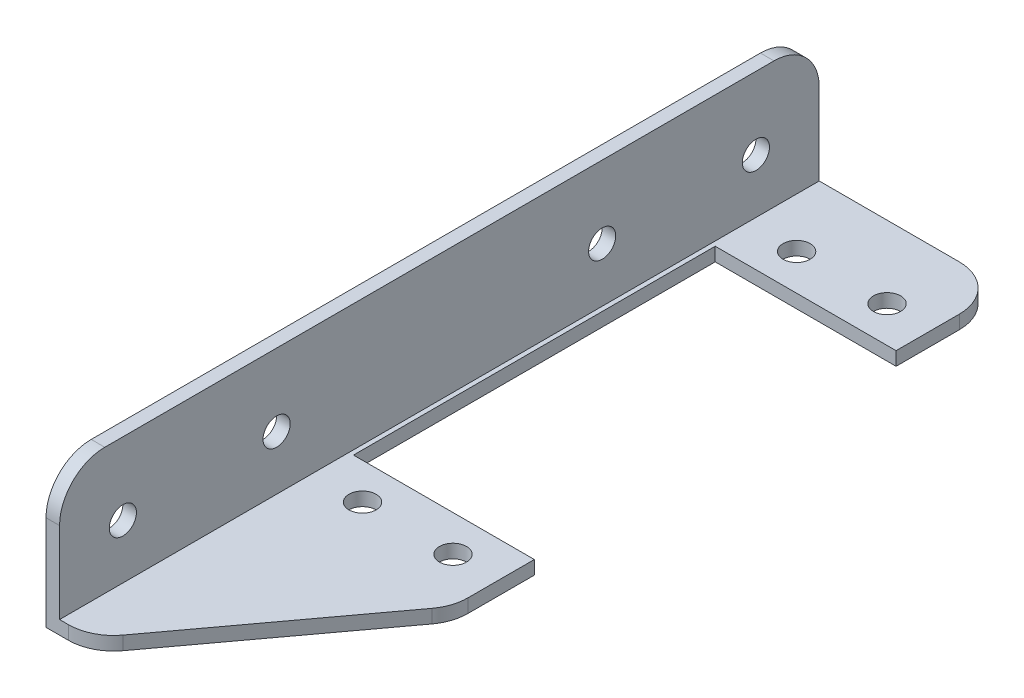
ISO-10303-21;
HEADER;
FILE_DESCRIPTION(('STEP AP214'),'2;1');
FILE_NAME('part.step','',(''),(''),'','','');
FILE_SCHEMA(('AUTOMOTIVE_DESIGN { 1 0 10303 214 1 1 1 1 }'));
ENDSEC;
DATA;
#1=APPLICATION_CONTEXT('core data for automotive mechanical design processes');
#2=APPLICATION_PROTOCOL_DEFINITION('international standard','automotive_design',2000,#1);
#3=PRODUCT_CONTEXT('',#1,'mechanical');
#4=PRODUCT('Part','Part','',(#3));
#5=PRODUCT_RELATED_PRODUCT_CATEGORY('part','',(#4));
#6=PRODUCT_DEFINITION_FORMATION('','',#4);
#7=PRODUCT_DEFINITION_CONTEXT('part definition',#1,'design');
#8=PRODUCT_DEFINITION('design','',#6,#7);
#9=PRODUCT_DEFINITION_SHAPE('','',#8);
#10=(LENGTH_UNIT() NAMED_UNIT(*) SI_UNIT(.MILLI.,.METRE.));
#11=(NAMED_UNIT(*) PLANE_ANGLE_UNIT() SI_UNIT($,.RADIAN.));
#12=(NAMED_UNIT(*) SI_UNIT($,.STERADIAN.) SOLID_ANGLE_UNIT());
#13=UNCERTAINTY_MEASURE_WITH_UNIT(LENGTH_MEASURE(1.E-05),#10,'distance_accuracy_value','');
#14=(GEOMETRIC_REPRESENTATION_CONTEXT(3) GLOBAL_UNCERTAINTY_ASSIGNED_CONTEXT((#13)) GLOBAL_UNIT_ASSIGNED_CONTEXT((#10,
#11,#12)) REPRESENTATION_CONTEXT('',''));
#15=CARTESIAN_POINT('',(0.,0.,0.));
#16=DIRECTION('',(0.,0.,1.));
#17=DIRECTION('',(1.,0.,0.));
#18=AXIS2_PLACEMENT_3D('',#15,#16,#17);
#19=CARTESIAN_POINT('',(0.,0.,84.));
#20=DIRECTION('',(0.,1.,0.));
#21=DIRECTION('',(0.,0.,1.));
#22=AXIS2_PLACEMENT_3D('',#19,#20,#21);
#23=PLANE('',#22);
#24=CARTESIAN_POINT('',(7.,0.,8.));
#25=DIRECTION('',(0.,-1.,0.));
#26=DIRECTION('',(0.,0.,1.));
#27=AXIS2_PLACEMENT_3D('',#24,#25,#26);
#28=CIRCLE('',#27,1.5);
#29=CARTESIAN_POINT('',(7.,0.,9.5));
#30=VERTEX_POINT('',#29);
#31=EDGE_CURVE('E318',#30,#30,#28,.T.);
#32=ORIENTED_EDGE('',*,*,#31,.F.);
#33=EDGE_LOOP('',(#32));
#34=FACE_BOUND('',#33,.T.);
#35=CARTESIAN_POINT('',(17.,0.,8.));
#36=DIRECTION('',(0.,-1.,0.));
#37=DIRECTION('',(0.,0.,1.));
#38=AXIS2_PLACEMENT_3D('',#35,#36,#37);
#39=CIRCLE('',#38,1.5);
#40=CARTESIAN_POINT('',(17.,0.,9.5));
#41=VERTEX_POINT('',#40);
#42=EDGE_CURVE('E321',#41,#41,#39,.T.);
#43=ORIENTED_EDGE('',*,*,#42,.F.);
#44=EDGE_LOOP('',(#43));
#45=FACE_BOUND('',#44,.T.);
#46=CARTESIAN_POINT('',(17.,0.,56.));
#47=DIRECTION('',(0.,-1.,0.));
#48=DIRECTION('',(0.,0.,-1.));
#49=AXIS2_PLACEMENT_3D('',#46,#47,#48);
#50=CIRCLE('',#49,1.5);
#51=CARTESIAN_POINT('',(17.,0.,54.5));
#52=VERTEX_POINT('',#51);
#53=EDGE_CURVE('E334',#52,#52,#50,.T.);
#54=ORIENTED_EDGE('',*,*,#53,.F.);
#55=EDGE_LOOP('',(#54));
#56=FACE_BOUND('',#55,.T.);
#57=CARTESIAN_POINT('',(7.,0.,56.));
#58=DIRECTION('',(0.,-1.,0.));
#59=DIRECTION('',(0.,0.,-1.));
#60=AXIS2_PLACEMENT_3D('',#57,#58,#59);
#61=CIRCLE('',#60,1.5);
#62=CARTESIAN_POINT('',(7.,0.,54.5));
#63=VERTEX_POINT('',#62);
#64=EDGE_CURVE('E332',#63,#63,#61,.T.);
#65=ORIENTED_EDGE('',*,*,#64,.F.);
#66=EDGE_LOOP('',(#65));
#67=FACE_BOUND('',#66,.T.);
#68=DIRECTION('',(0.,0.,-1.));
#69=VECTOR('',#68,1.);
#70=CARTESIAN_POINT('',(22.,0.,84.));
#71=LINE('',#70,#69);
#72=CARTESIAN_POINT('',(22.,0.,59.3527355023087));
#73=VERTEX_POINT('',#72);
#74=CARTESIAN_POINT('',(22.,0.,52.));
#75=VERTEX_POINT('',#74);
#76=EDGE_CURVE('E165',#73,#75,#71,.T.);
#77=ORIENTED_EDGE('',*,*,#76,.F.);
#78=CARTESIAN_POINT('',(17.,0.,59.3527355023087));
#79=DIRECTION('',(0.,1.,0.));
#80=DIRECTION('',(0.,0.,1.));
#81=AXIS2_PLACEMENT_3D('',#78,#79,#80);
#82=CIRCLE('',#81,5.);
#83=CARTESIAN_POINT('',(21.0208807073316,0.,62.3246908077277));
#84=VERTEX_POINT('',#83);
#85=EDGE_CURVE('E270',#73,#84,#82,.F.);
#86=ORIENTED_EDGE('',*,*,#85,.T.);
#87=DIRECTION('',(0.594391061083805,0.,-0.804176141466326));
#88=VECTOR('',#87,1.);
#89=CARTESIAN_POINT('',(22.,0.,60.9999999999999));
#90=LINE('',#89,#88);
#91=CARTESIAN_POINT('',(6.49898955686415,0.,81.971955305419));
#92=VERTEX_POINT('',#91);
#93=EDGE_CURVE('E258',#84,#92,#90,.F.);
#94=ORIENTED_EDGE('',*,*,#93,.T.);
#95=CARTESIAN_POINT('',(2.47810884953252,0.,79.));
#96=DIRECTION('',(0.,1.,0.));
#97=DIRECTION('',(0.,0.,1.));
#98=AXIS2_PLACEMENT_3D('',#95,#96,#97);
#99=CIRCLE('',#98,5.);
#100=CARTESIAN_POINT('',(2.47810884953252,0.,84.));
#101=VERTEX_POINT('',#100);
#102=EDGE_CURVE('E268',#92,#101,#99,.F.);
#103=ORIENTED_EDGE('',*,*,#102,.T.);
#104=DIRECTION('',(1.,0.,0.));
#105=VECTOR('',#104,1.);
#106=CARTESIAN_POINT('',(0.,0.,84.));
#107=LINE('',#106,#105);
#108=CARTESIAN_POINT('',(0.,0.,84.));
#109=VERTEX_POINT('',#108);
#110=EDGE_CURVE('E208',#109,#101,#107,.T.);
#111=ORIENTED_EDGE('',*,*,#110,.F.);
#112=DIRECTION('',(0.,0.,-1.));
#113=VECTOR('',#112,1.);
#114=CARTESIAN_POINT('',(0.,0.,84.));
#115=LINE('',#114,#113);
#116=CARTESIAN_POINT('',(0.,0.,0.));
#117=VERTEX_POINT('',#116);
#118=EDGE_CURVE('E219',#109,#117,#115,.T.);
#119=ORIENTED_EDGE('',*,*,#118,.T.);
#120=DIRECTION('',(1.,0.,0.));
#121=VECTOR('',#120,1.);
#122=CARTESIAN_POINT('',(0.,0.,0.));
#123=LINE('',#122,#121);
#124=CARTESIAN_POINT('',(17.,0.,0.));
#125=VERTEX_POINT('',#124);
#126=EDGE_CURVE('E207',#117,#125,#123,.T.);
#127=ORIENTED_EDGE('',*,*,#126,.T.);
#128=CARTESIAN_POINT('',(17.,0.,5.));
#129=DIRECTION('',(0.,1.,0.));
#130=DIRECTION('',(0.,0.,1.));
#131=AXIS2_PLACEMENT_3D('',#128,#129,#130);
#132=CIRCLE('',#131,5.);
#133=CARTESIAN_POINT('',(22.,0.,5.00000000000003));
#134=VERTEX_POINT('',#133);
#135=EDGE_CURVE('E164',#125,#134,#132,.F.);
#136=ORIENTED_EDGE('',*,*,#135,.T.);
#137=CARTESIAN_POINT('',(22.,0.,12.));
#138=VERTEX_POINT('',#137);
#139=EDGE_CURVE('E149',#138,#134,#71,.T.);
#140=ORIENTED_EDGE('',*,*,#139,.F.);
#141=DIRECTION('',(1.,0.,0.));
#142=VECTOR('',#141,1.);
#143=CARTESIAN_POINT('',(27.5,0.,12.));
#144=LINE('',#143,#142);
#145=CARTESIAN_POINT('',(2.,0.,12.));
#146=VERTEX_POINT('',#145);
#147=EDGE_CURVE('E162',#146,#138,#144,.T.);
#148=ORIENTED_EDGE('',*,*,#147,.F.);
#149=DIRECTION('',(0.,0.,-1.));
#150=VECTOR('',#149,1.);
#151=CARTESIAN_POINT('',(2.,0.,52.));
#152=LINE('',#151,#150);
#153=CARTESIAN_POINT('',(2.,0.,52.));
#154=VERTEX_POINT('',#153);
#155=EDGE_CURVE('E172',#154,#146,#152,.T.);
#156=ORIENTED_EDGE('',*,*,#155,.F.);
#157=DIRECTION('',(-1.,0.,0.));
#158=VECTOR('',#157,1.);
#159=CARTESIAN_POINT('',(27.5,0.,52.));
#160=LINE('',#159,#158);
#161=EDGE_CURVE('E176',#75,#154,#160,.T.);
#162=ORIENTED_EDGE('',*,*,#161,.F.);
#163=EDGE_LOOP('',(#77,#86,#94,#103,#111,#119,#127,#136,#140,#148,#156,#162));
#164=FACE_BOUND('',#163,.T.);
#165=ADVANCED_FACE('F32',(#34,#45,#56,#67,#164),#23,.F.);
#166=CARTESIAN_POINT('',(0.,1.5,84.));
#167=DIRECTION('',(0.,1.,0.));
#168=DIRECTION('',(0.,0.,1.));
#169=AXIS2_PLACEMENT_3D('',#166,#167,#168);
#170=PLANE('',#169);
#171=DIRECTION('',(-0.594391061083805,0.,0.804176141466326));
#172=VECTOR('',#171,1.);
#173=CARTESIAN_POINT('',(3.23349633251831,1.5,86.3899755501222));
#174=LINE('',#173,#172);
#175=CARTESIAN_POINT('',(6.49898955686415,1.5,81.971955305419));
#176=VERTEX_POINT('',#175);
#177=CARTESIAN_POINT('',(21.0208807073316,1.5,62.3246908077277));
#178=VERTEX_POINT('',#177);
#179=EDGE_CURVE('E261',#176,#178,#174,.F.);
#180=ORIENTED_EDGE('',*,*,#179,.T.);
#181=CARTESIAN_POINT('',(17.,1.5,59.3527355023087));
#182=DIRECTION('',(0.,1.,0.));
#183=DIRECTION('',(0.,0.,1.));
#184=AXIS2_PLACEMENT_3D('',#181,#182,#183);
#185=CIRCLE('',#184,5.);
#186=CARTESIAN_POINT('',(22.,1.5,59.3527355023087));
#187=VERTEX_POINT('',#186);
#188=EDGE_CURVE('E280',#178,#187,#185,.T.);
#189=ORIENTED_EDGE('',*,*,#188,.T.);
#190=DIRECTION('',(0.,0.,1.));
#191=VECTOR('',#190,1.);
#192=CARTESIAN_POINT('',(22.,1.5,84.));
#193=LINE('',#192,#191);
#194=CARTESIAN_POINT('',(22.,1.5,52.));
#195=VERTEX_POINT('',#194);
#196=EDGE_CURVE('E156',#195,#187,#193,.T.);
#197=ORIENTED_EDGE('',*,*,#196,.F.);
#198=DIRECTION('',(1.,0.,0.));
#199=VECTOR('',#198,1.);
#200=CARTESIAN_POINT('',(0.,1.5,52.));
#201=LINE('',#200,#199);
#202=CARTESIAN_POINT('',(2.,1.5,52.));
#203=VERTEX_POINT('',#202);
#204=EDGE_CURVE('E237',#203,#195,#201,.T.);
#205=ORIENTED_EDGE('',*,*,#204,.F.);
#206=DIRECTION('',(0.,0.,1.));
#207=VECTOR('',#206,1.);
#208=CARTESIAN_POINT('',(2.,1.5,84.));
#209=LINE('',#208,#207);
#210=CARTESIAN_POINT('',(2.,1.5,12.));
#211=VERTEX_POINT('',#210);
#212=EDGE_CURVE('E240',#211,#203,#209,.T.);
#213=ORIENTED_EDGE('',*,*,#212,.F.);
#214=DIRECTION('',(-1.,0.,0.));
#215=VECTOR('',#214,1.);
#216=CARTESIAN_POINT('',(0.,1.5,12.));
#217=LINE('',#216,#215);
#218=CARTESIAN_POINT('',(22.,1.5,12.));
#219=VERTEX_POINT('',#218);
#220=EDGE_CURVE('E243',#219,#211,#217,.T.);
#221=ORIENTED_EDGE('',*,*,#220,.F.);
#222=CARTESIAN_POINT('',(22.,1.5,5.));
#223=VERTEX_POINT('',#222);
#224=EDGE_CURVE('E152',#223,#219,#193,.T.);
#225=ORIENTED_EDGE('',*,*,#224,.F.);
#226=CARTESIAN_POINT('',(17.,1.5,5.));
#227=DIRECTION('',(0.,1.,0.));
#228=DIRECTION('',(0.,0.,1.));
#229=AXIS2_PLACEMENT_3D('',#226,#227,#228);
#230=CIRCLE('',#229,5.);
#231=CARTESIAN_POINT('',(17.,1.5,0.));
#232=VERTEX_POINT('',#231);
#233=EDGE_CURVE('E276',#223,#232,#230,.T.);
#234=ORIENTED_EDGE('',*,*,#233,.T.);
#235=DIRECTION('',(1.,0.,0.));
#236=VECTOR('',#235,1.);
#237=CARTESIAN_POINT('',(0.,1.5,0.));
#238=LINE('',#237,#236);
#239=CARTESIAN_POINT('',(1.5,1.5,0.));
#240=VERTEX_POINT('',#239);
#241=EDGE_CURVE('E221',#240,#232,#238,.T.);
#242=ORIENTED_EDGE('',*,*,#241,.F.);
#243=DIRECTION('',(0.,0.,-1.));
#244=VECTOR('',#243,1.);
#245=CARTESIAN_POINT('',(1.5,1.5,84.));
#246=LINE('',#245,#244);
#247=CARTESIAN_POINT('',(1.5,1.5,84.));
#248=VERTEX_POINT('',#247);
#249=EDGE_CURVE('E234',#248,#240,#246,.T.);
#250=ORIENTED_EDGE('',*,*,#249,.F.);
#251=DIRECTION('',(1.,0.,0.));
#252=VECTOR('',#251,1.);
#253=CARTESIAN_POINT('',(0.,1.5,84.));
#254=LINE('',#253,#252);
#255=CARTESIAN_POINT('',(2.47810884953252,1.5,84.));
#256=VERTEX_POINT('',#255);
#257=EDGE_CURVE('E211',#248,#256,#254,.T.);
#258=ORIENTED_EDGE('',*,*,#257,.T.);
#259=CARTESIAN_POINT('',(2.47810884953252,1.5,79.));
#260=DIRECTION('',(0.,1.,0.));
#261=DIRECTION('',(0.,0.,1.));
#262=AXIS2_PLACEMENT_3D('',#259,#260,#261);
#263=CIRCLE('',#262,5.);
#264=EDGE_CURVE('E278',#256,#176,#263,.T.);
#265=ORIENTED_EDGE('',*,*,#264,.T.);
#266=EDGE_LOOP('',(#180,#189,#197,#205,#213,#221,#225,#234,#242,#250,#258,#265));
#267=FACE_BOUND('',#266,.T.);
#268=CARTESIAN_POINT('',(7.,1.5,8.));
#269=DIRECTION('',(0.,1.,0.));
#270=DIRECTION('',(0.,0.,1.));
#271=AXIS2_PLACEMENT_3D('',#268,#269,#270);
#272=CIRCLE('',#271,1.5);
#273=CARTESIAN_POINT('',(7.,1.5,9.5));
#274=VERTEX_POINT('',#273);
#275=EDGE_CURVE('E195',#274,#274,#272,.T.);
#276=ORIENTED_EDGE('',*,*,#275,.F.);
#277=EDGE_LOOP('',(#276));
#278=FACE_BOUND('',#277,.T.);
#279=CARTESIAN_POINT('',(17.,1.5,8.));
#280=DIRECTION('',(0.,1.,0.));
#281=DIRECTION('',(0.,0.,1.));
#282=AXIS2_PLACEMENT_3D('',#279,#280,#281);
#283=CIRCLE('',#282,1.5);
#284=CARTESIAN_POINT('',(17.,1.5,9.5));
#285=VERTEX_POINT('',#284);
#286=EDGE_CURVE('E251',#285,#285,#283,.T.);
#287=ORIENTED_EDGE('',*,*,#286,.F.);
#288=EDGE_LOOP('',(#287));
#289=FACE_BOUND('',#288,.T.);
#290=CARTESIAN_POINT('',(17.,1.5,56.));
#291=DIRECTION('',(0.,1.,0.));
#292=DIRECTION('',(0.,0.,1.));
#293=AXIS2_PLACEMENT_3D('',#290,#291,#292);
#294=CIRCLE('',#293,1.5);
#295=CARTESIAN_POINT('',(17.,1.5,57.5));
#296=VERTEX_POINT('',#295);
#297=EDGE_CURVE('E248',#296,#296,#294,.T.);
#298=ORIENTED_EDGE('',*,*,#297,.F.);
#299=EDGE_LOOP('',(#298));
#300=FACE_BOUND('',#299,.T.);
#301=CARTESIAN_POINT('',(7.,1.5,56.));
#302=DIRECTION('',(0.,1.,0.));
#303=DIRECTION('',(0.,0.,1.));
#304=AXIS2_PLACEMENT_3D('',#301,#302,#303);
#305=CIRCLE('',#304,1.5);
#306=CARTESIAN_POINT('',(7.,1.5,57.5));
#307=VERTEX_POINT('',#306);
#308=EDGE_CURVE('E180',#307,#307,#305,.T.);
#309=ORIENTED_EDGE('',*,*,#308,.F.);
#310=EDGE_LOOP('',(#309));
#311=FACE_BOUND('',#310,.T.);
#312=ADVANCED_FACE('F312',(#267,#278,#289,#300,#311),#170,.T.);
#313=CARTESIAN_POINT('',(1.5,15.5,84.));
#314=DIRECTION('',(1.,0.,0.));
#315=DIRECTION('',(0.,1.,0.));
#316=AXIS2_PLACEMENT_3D('',#313,#314,#315);
#317=PLANE('',#316);
#318=CARTESIAN_POINT('',(1.5,7.5,7.));
#319=DIRECTION('',(1.,0.,0.));
#320=DIRECTION('',(0.,1.,0.));
#321=AXIS2_PLACEMENT_3D('',#318,#319,#320);
#322=CIRCLE('',#321,1.5);
#323=CARTESIAN_POINT('',(1.5,9.00000000000001,7.));
#324=VERTEX_POINT('',#323);
#325=EDGE_CURVE('E204',#324,#324,#322,.T.);
#326=ORIENTED_EDGE('',*,*,#325,.F.);
#327=EDGE_LOOP('',(#326));
#328=FACE_BOUND('',#327,.T.);
#329=CARTESIAN_POINT('',(1.5,7.5,24.));
#330=DIRECTION('',(1.,0.,0.));
#331=DIRECTION('',(0.,1.,0.));
#332=AXIS2_PLACEMENT_3D('',#329,#330,#331);
#333=CIRCLE('',#332,1.5);
#334=CARTESIAN_POINT('',(1.5,9.00000000000001,24.));
#335=VERTEX_POINT('',#334);
#336=EDGE_CURVE('E201',#335,#335,#333,.T.);
#337=ORIENTED_EDGE('',*,*,#336,.F.);
#338=EDGE_LOOP('',(#337));
#339=FACE_BOUND('',#338,.T.);
#340=CARTESIAN_POINT('',(1.5,7.50000000000001,60.));
#341=DIRECTION('',(1.,0.,0.));
#342=DIRECTION('',(0.,1.,0.));
#343=AXIS2_PLACEMENT_3D('',#340,#341,#342);
#344=CIRCLE('',#343,1.5);
#345=CARTESIAN_POINT('',(1.5,9.00000000000001,60.));
#346=VERTEX_POINT('',#345);
#347=EDGE_CURVE('E198',#346,#346,#344,.T.);
#348=ORIENTED_EDGE('',*,*,#347,.F.);
#349=EDGE_LOOP('',(#348));
#350=FACE_BOUND('',#349,.T.);
#351=CARTESIAN_POINT('',(1.5,7.50000000000001,77.));
#352=DIRECTION('',(1.,0.,0.));
#353=DIRECTION('',(0.,1.,0.));
#354=AXIS2_PLACEMENT_3D('',#351,#352,#353);
#355=CIRCLE('',#354,1.5);
#356=CARTESIAN_POINT('',(1.5,9.00000000000001,77.));
#357=VERTEX_POINT('',#356);
#358=EDGE_CURVE('E185',#357,#357,#355,.T.);
#359=ORIENTED_EDGE('',*,*,#358,.F.);
#360=EDGE_LOOP('',(#359));
#361=FACE_BOUND('',#360,.T.);
#362=DIRECTION('',(0.,0.,-1.));
#363=VECTOR('',#362,1.);
#364=CARTESIAN_POINT('',(1.5,15.5,84.));
#365=LINE('',#364,#363);
#366=CARTESIAN_POINT('',(1.5,15.5,79.));
#367=VERTEX_POINT('',#366);
#368=CARTESIAN_POINT('',(1.5,15.5,5.00000000000003));
#369=VERTEX_POINT('',#368);
#370=EDGE_CURVE('E231',#367,#369,#365,.T.);
#371=ORIENTED_EDGE('',*,*,#370,.F.);
#372=CARTESIAN_POINT('',(1.5,10.5,79.));
#373=DIRECTION('',(1.,0.,0.));
#374=DIRECTION('',(0.,1.,0.));
#375=AXIS2_PLACEMENT_3D('',#372,#373,#374);
#376=CIRCLE('',#375,5.);
#377=CARTESIAN_POINT('',(1.5,10.5,84.));
#378=VERTEX_POINT('',#377);
#379=EDGE_CURVE('E293',#367,#378,#376,.T.);
#380=ORIENTED_EDGE('',*,*,#379,.T.);
#381=DIRECTION('',(0.,-1.,0.));
#382=VECTOR('',#381,1.);
#383=CARTESIAN_POINT('',(1.5,15.5,84.));
#384=LINE('',#383,#382);
#385=EDGE_CURVE('E215',#378,#248,#384,.T.);
#386=ORIENTED_EDGE('',*,*,#385,.T.);
#387=ORIENTED_EDGE('',*,*,#249,.T.);
#388=DIRECTION('',(0.,-1.,0.));
#389=VECTOR('',#388,1.);
#390=CARTESIAN_POINT('',(1.5,15.5,0.));
#391=LINE('',#390,#389);
#392=CARTESIAN_POINT('',(1.5,10.5,0.));
#393=VERTEX_POINT('',#392);
#394=EDGE_CURVE('E224',#393,#240,#391,.T.);
#395=ORIENTED_EDGE('',*,*,#394,.F.);
#396=CARTESIAN_POINT('',(1.5,10.5,5.));
#397=DIRECTION('',(1.,0.,0.));
#398=DIRECTION('',(0.,1.,0.));
#399=AXIS2_PLACEMENT_3D('',#396,#397,#398);
#400=CIRCLE('',#399,5.);
#401=EDGE_CURVE('E55',#393,#369,#400,.T.);
#402=ORIENTED_EDGE('',*,*,#401,.T.);
#403=EDGE_LOOP('',(#371,#380,#386,#387,#395,#402));
#404=FACE_BOUND('',#403,.T.);
#405=ADVANCED_FACE('F306',(#328,#339,#350,#361,#404),#317,.T.);
#406=CARTESIAN_POINT('',(0.,15.5,84.));
#407=DIRECTION('',(0.,1.,0.));
#408=DIRECTION('',(0.,0.,1.));
#409=AXIS2_PLACEMENT_3D('',#406,#407,#408);
#410=PLANE('',#409);
#411=DIRECTION('',(0.,0.,-1.));
#412=VECTOR('',#411,1.);
#413=CARTESIAN_POINT('',(0.,15.5,84.));
#414=LINE('',#413,#412);
#415=CARTESIAN_POINT('',(0.,15.5,79.));
#416=VERTEX_POINT('',#415);
#417=CARTESIAN_POINT('',(0.,15.5,5.00000000000003));
#418=VERTEX_POINT('',#417);
#419=EDGE_CURVE('E229',#416,#418,#414,.T.);
#420=ORIENTED_EDGE('',*,*,#419,.F.);
#421=DIRECTION('',(1.,0.,0.));
#422=VECTOR('',#421,1.);
#423=CARTESIAN_POINT('',(1.5,15.5,79.));
#424=LINE('',#423,#422);
#425=EDGE_CURVE('E289',#416,#367,#424,.T.);
#426=ORIENTED_EDGE('',*,*,#425,.T.);
#427=ORIENTED_EDGE('',*,*,#370,.T.);
#428=DIRECTION('',(1.,0.,0.));
#429=VECTOR('',#428,1.);
#430=CARTESIAN_POINT('',(0.,15.5,5.));
#431=LINE('',#430,#429);
#432=EDGE_CURVE('E287',#369,#418,#431,.F.);
#433=ORIENTED_EDGE('',*,*,#432,.T.);
#434=EDGE_LOOP('',(#420,#426,#427,#433));
#435=FACE_BOUND('',#434,.T.);
#436=ADVANCED_FACE('F402',(#435),#410,.T.);
#437=CARTESIAN_POINT('',(0.,15.5,84.));
#438=DIRECTION('',(1.,0.,0.));
#439=DIRECTION('',(0.,1.,0.));
#440=AXIS2_PLACEMENT_3D('',#437,#438,#439);
#441=PLANE('',#440);
#442=CARTESIAN_POINT('',(0.,7.5,7.));
#443=DIRECTION('',(-1.,0.,0.));
#444=DIRECTION('',(0.,-1.,0.));
#445=AXIS2_PLACEMENT_3D('',#442,#443,#444);
#446=CIRCLE('',#445,1.5);
#447=CARTESIAN_POINT('',(0.,6.,7.));
#448=VERTEX_POINT('',#447);
#449=EDGE_CURVE('E182',#448,#448,#446,.T.);
#450=ORIENTED_EDGE('',*,*,#449,.F.);
#451=EDGE_LOOP('',(#450));
#452=FACE_BOUND('',#451,.T.);
#453=CARTESIAN_POINT('',(0.,7.5,24.));
#454=DIRECTION('',(-1.,0.,0.));
#455=DIRECTION('',(0.,-1.,0.));
#456=AXIS2_PLACEMENT_3D('',#453,#454,#455);
#457=CIRCLE('',#456,1.5);
#458=CARTESIAN_POINT('',(0.,6.,24.));
#459=VERTEX_POINT('',#458);
#460=EDGE_CURVE('E186',#459,#459,#457,.T.);
#461=ORIENTED_EDGE('',*,*,#460,.F.);
#462=EDGE_LOOP('',(#461));
#463=FACE_BOUND('',#462,.T.);
#464=CARTESIAN_POINT('',(0.,7.5,60.));
#465=DIRECTION('',(-1.,0.,0.));
#466=DIRECTION('',(0.,-1.,0.));
#467=AXIS2_PLACEMENT_3D('',#464,#465,#466);
#468=CIRCLE('',#467,1.5);
#469=CARTESIAN_POINT('',(0.,6.,60.));
#470=VERTEX_POINT('',#469);
#471=EDGE_CURVE('E189',#470,#470,#468,.T.);
#472=ORIENTED_EDGE('',*,*,#471,.F.);
#473=EDGE_LOOP('',(#472));
#474=FACE_BOUND('',#473,.T.);
#475=CARTESIAN_POINT('',(0.,7.50000000000001,77.));
#476=DIRECTION('',(-1.,0.,0.));
#477=DIRECTION('',(0.,1.,0.));
#478=AXIS2_PLACEMENT_3D('',#475,#476,#477);
#479=CIRCLE('',#478,1.5);
#480=CARTESIAN_POINT('',(0.,9.00000000000001,77.));
#481=VERTEX_POINT('',#480);
#482=EDGE_CURVE('E192',#481,#481,#479,.T.);
#483=ORIENTED_EDGE('',*,*,#482,.F.);
#484=EDGE_LOOP('',(#483));
#485=FACE_BOUND('',#484,.T.);
#486=DIRECTION('',(0.,-1.,0.));
#487=VECTOR('',#486,1.);
#488=CARTESIAN_POINT('',(0.,15.5,84.));
#489=LINE('',#488,#487);
#490=CARTESIAN_POINT('',(0.,10.5,84.));
#491=VERTEX_POINT('',#490);
#492=EDGE_CURVE('E217',#491,#109,#489,.T.);
#493=ORIENTED_EDGE('',*,*,#492,.F.);
#494=CARTESIAN_POINT('',(0.,10.5,79.));
#495=DIRECTION('',(1.,0.,0.));
#496=DIRECTION('',(0.,1.,0.));
#497=AXIS2_PLACEMENT_3D('',#494,#495,#496);
#498=CIRCLE('',#497,5.);
#499=EDGE_CURVE('E296',#491,#416,#498,.F.);
#500=ORIENTED_EDGE('',*,*,#499,.T.);
#501=ORIENTED_EDGE('',*,*,#419,.T.);
#502=CARTESIAN_POINT('',(0.,10.5,5.));
#503=DIRECTION('',(1.,0.,0.));
#504=DIRECTION('',(0.,1.,0.));
#505=AXIS2_PLACEMENT_3D('',#502,#503,#504);
#506=CIRCLE('',#505,5.);
#507=CARTESIAN_POINT('',(0.,10.5,0.));
#508=VERTEX_POINT('',#507);
#509=EDGE_CURVE('E47',#418,#508,#506,.F.);
#510=ORIENTED_EDGE('',*,*,#509,.T.);
#511=DIRECTION('',(0.,-1.,0.));
#512=VECTOR('',#511,1.);
#513=CARTESIAN_POINT('',(0.,15.5,0.));
#514=LINE('',#513,#512);
#515=EDGE_CURVE('E212',#508,#117,#514,.T.);
#516=ORIENTED_EDGE('',*,*,#515,.T.);
#517=ORIENTED_EDGE('',*,*,#118,.F.);
#518=EDGE_LOOP('',(#493,#500,#501,#510,#516,#517));
#519=FACE_BOUND('',#518,.T.);
#520=ADVANCED_FACE('F396',(#452,#463,#474,#485,#519),#441,.F.);
#521=CARTESIAN_POINT('',(0.,0.,84.));
#522=DIRECTION('',(0.,0.,-1.));
#523=DIRECTION('',(-1.,0.,0.));
#524=AXIS2_PLACEMENT_3D('',#521,#522,#523);
#525=PLANE('',#524);
#526=ORIENTED_EDGE('',*,*,#110,.T.);
#527=DIRECTION('',(0.,-1.,0.));
#528=VECTOR('',#527,1.);
#529=CARTESIAN_POINT('',(2.47810884953252,1.5,84.));
#530=LINE('',#529,#528);
#531=EDGE_CURVE('E284',#101,#256,#530,.F.);
#532=ORIENTED_EDGE('',*,*,#531,.T.);
#533=ORIENTED_EDGE('',*,*,#257,.F.);
#534=ORIENTED_EDGE('',*,*,#385,.F.);
#535=DIRECTION('',(1.,0.,0.));
#536=VECTOR('',#535,1.);
#537=CARTESIAN_POINT('',(0.,10.5,84.));
#538=LINE('',#537,#536);
#539=EDGE_CURVE('E282',#378,#491,#538,.F.);
#540=ORIENTED_EDGE('',*,*,#539,.T.);
#541=ORIENTED_EDGE('',*,*,#492,.T.);
#542=EDGE_LOOP('',(#526,#532,#533,#534,#540,#541));
#543=FACE_BOUND('',#542,.T.);
#544=ADVANCED_FACE('F393',(#543),#525,.F.);
#545=CARTESIAN_POINT('',(0.,0.,0.));
#546=DIRECTION('',(0.,0.,-1.));
#547=DIRECTION('',(-1.,0.,0.));
#548=AXIS2_PLACEMENT_3D('',#545,#546,#547);
#549=PLANE('',#548);
#550=ORIENTED_EDGE('',*,*,#515,.F.);
#551=DIRECTION('',(1.,0.,0.));
#552=VECTOR('',#551,1.);
#553=CARTESIAN_POINT('',(0.,10.5,0.));
#554=LINE('',#553,#552);
#555=EDGE_CURVE('E40',#508,#393,#554,.T.);
#556=ORIENTED_EDGE('',*,*,#555,.T.);
#557=ORIENTED_EDGE('',*,*,#394,.T.);
#558=ORIENTED_EDGE('',*,*,#241,.T.);
#559=DIRECTION('',(0.,-1.,0.));
#560=VECTOR('',#559,1.);
#561=CARTESIAN_POINT('',(17.,0.,0.));
#562=LINE('',#561,#560);
#563=EDGE_CURVE('E298',#232,#125,#562,.T.);
#564=ORIENTED_EDGE('',*,*,#563,.T.);
#565=ORIENTED_EDGE('',*,*,#126,.F.);
#566=EDGE_LOOP('',(#550,#556,#557,#558,#564,#565));
#567=FACE_BOUND('',#566,.T.);
#568=ADVANCED_FACE('F302',(#567),#549,.T.);
#569=CARTESIAN_POINT('',(8.,7.50000000000001,77.));
#570=DIRECTION('',(-1.,0.,0.));
#571=DIRECTION('',(0.,-1.,0.));
#572=AXIS2_PLACEMENT_3D('',#569,#570,#571);
#573=CYLINDRICAL_SURFACE('',#572,1.5);
#574=ORIENTED_EDGE('',*,*,#358,.T.);
#575=EDGE_LOOP('',(#574));
#576=FACE_BOUND('',#575,.T.);
#577=ORIENTED_EDGE('',*,*,#482,.T.);
#578=EDGE_LOOP('',(#577));
#579=FACE_BOUND('',#578,.T.);
#580=ADVANCED_FACE('F388',(#576,#579),#573,.F.);
#581=CARTESIAN_POINT('',(8.,7.50000000000001,60.));
#582=DIRECTION('',(-1.,0.,0.));
#583=DIRECTION('',(0.,-1.,0.));
#584=AXIS2_PLACEMENT_3D('',#581,#582,#583);
#585=CYLINDRICAL_SURFACE('',#584,1.5);
#586=ORIENTED_EDGE('',*,*,#347,.T.);
#587=EDGE_LOOP('',(#586));
#588=FACE_BOUND('',#587,.T.);
#589=ORIENTED_EDGE('',*,*,#471,.T.);
#590=EDGE_LOOP('',(#589));
#591=FACE_BOUND('',#590,.T.);
#592=ADVANCED_FACE('F384',(#588,#591),#585,.F.);
#593=CARTESIAN_POINT('',(8.,7.5,24.));
#594=DIRECTION('',(-1.,0.,0.));
#595=DIRECTION('',(0.,-1.,0.));
#596=AXIS2_PLACEMENT_3D('',#593,#594,#595);
#597=CYLINDRICAL_SURFACE('',#596,1.5);
#598=ORIENTED_EDGE('',*,*,#336,.T.);
#599=EDGE_LOOP('',(#598));
#600=FACE_BOUND('',#599,.T.);
#601=ORIENTED_EDGE('',*,*,#460,.T.);
#602=EDGE_LOOP('',(#601));
#603=FACE_BOUND('',#602,.T.);
#604=ADVANCED_FACE('F380',(#600,#603),#597,.F.);
#605=CARTESIAN_POINT('',(8.,7.5,7.));
#606=DIRECTION('',(-1.,0.,0.));
#607=DIRECTION('',(0.,-1.,0.));
#608=AXIS2_PLACEMENT_3D('',#605,#606,#607);
#609=CYLINDRICAL_SURFACE('',#608,1.5);
#610=ORIENTED_EDGE('',*,*,#325,.T.);
#611=EDGE_LOOP('',(#610));
#612=FACE_BOUND('',#611,.T.);
#613=ORIENTED_EDGE('',*,*,#449,.T.);
#614=EDGE_LOOP('',(#613));
#615=FACE_BOUND('',#614,.T.);
#616=ADVANCED_FACE('F374',(#612,#615),#609,.F.);
#617=CARTESIAN_POINT('',(27.5,5.,12.));
#618=DIRECTION('',(0.,0.,-1.));
#619=DIRECTION('',(-1.,0.,0.));
#620=AXIS2_PLACEMENT_3D('',#617,#618,#619);
#621=PLANE('',#620);
#622=ORIENTED_EDGE('',*,*,#147,.T.);
#623=DIRECTION('',(0.,1.,0.));
#624=VECTOR('',#623,1.);
#625=CARTESIAN_POINT('',(22.,5.,12.));
#626=LINE('',#625,#624);
#627=EDGE_CURVE('E146',#138,#219,#626,.T.);
#628=ORIENTED_EDGE('',*,*,#627,.T.);
#629=ORIENTED_EDGE('',*,*,#220,.T.);
#630=DIRECTION('',(0.,-1.,0.));
#631=VECTOR('',#630,1.);
#632=CARTESIAN_POINT('',(2.,5.,12.));
#633=LINE('',#632,#631);
#634=EDGE_CURVE('E169',#211,#146,#633,.T.);
#635=ORIENTED_EDGE('',*,*,#634,.T.);
#636=EDGE_LOOP('',(#622,#628,#629,#635));
#637=FACE_BOUND('',#636,.T.);
#638=ADVANCED_FACE('F167',(#637),#621,.F.);
#639=CARTESIAN_POINT('',(2.,5.,52.));
#640=DIRECTION('',(-1.,0.,0.));
#641=DIRECTION('',(0.,0.,1.));
#642=AXIS2_PLACEMENT_3D('',#639,#640,#641);
#643=PLANE('',#642);
#644=ORIENTED_EDGE('',*,*,#212,.T.);
#645=DIRECTION('',(0.,-1.,0.));
#646=VECTOR('',#645,1.);
#647=CARTESIAN_POINT('',(2.,5.,52.));
#648=LINE('',#647,#646);
#649=EDGE_CURVE('E171',#203,#154,#648,.T.);
#650=ORIENTED_EDGE('',*,*,#649,.T.);
#651=ORIENTED_EDGE('',*,*,#155,.T.);
#652=ORIENTED_EDGE('',*,*,#634,.F.);
#653=EDGE_LOOP('',(#644,#650,#651,#652));
#654=FACE_BOUND('',#653,.T.);
#655=ADVANCED_FACE('F361',(#654),#643,.F.);
#656=CARTESIAN_POINT('',(27.5,5.,52.));
#657=DIRECTION('',(0.,0.,1.));
#658=DIRECTION('',(1.,0.,0.));
#659=AXIS2_PLACEMENT_3D('',#656,#657,#658);
#660=PLANE('',#659);
#661=ORIENTED_EDGE('',*,*,#204,.T.);
#662=DIRECTION('',(0.,-1.,0.));
#663=VECTOR('',#662,1.);
#664=CARTESIAN_POINT('',(22.,5.,52.));
#665=LINE('',#664,#663);
#666=EDGE_CURVE('E245',#195,#75,#665,.T.);
#667=ORIENTED_EDGE('',*,*,#666,.T.);
#668=ORIENTED_EDGE('',*,*,#161,.T.);
#669=ORIENTED_EDGE('',*,*,#649,.F.);
#670=EDGE_LOOP('',(#661,#667,#668,#669));
#671=FACE_BOUND('',#670,.T.);
#672=ADVANCED_FACE('F330',(#671),#660,.F.);
#673=CARTESIAN_POINT('',(7.,5.,56.));
#674=DIRECTION('',(0.,-1.,0.));
#675=DIRECTION('',(0.,0.,-1.));
#676=AXIS2_PLACEMENT_3D('',#673,#674,#675);
#677=CYLINDRICAL_SURFACE('',#676,1.5);
#678=ORIENTED_EDGE('',*,*,#308,.T.);
#679=EDGE_LOOP('',(#678));
#680=FACE_BOUND('',#679,.T.);
#681=ORIENTED_EDGE('',*,*,#64,.T.);
#682=EDGE_LOOP('',(#681));
#683=FACE_BOUND('',#682,.T.);
#684=ADVANCED_FACE('F350',(#680,#683),#677,.F.);
#685=CARTESIAN_POINT('',(17.,5.,56.));
#686=DIRECTION('',(0.,-1.,0.));
#687=DIRECTION('',(0.,0.,-1.));
#688=AXIS2_PLACEMENT_3D('',#685,#686,#687);
#689=CYLINDRICAL_SURFACE('',#688,1.5);
#690=ORIENTED_EDGE('',*,*,#297,.T.);
#691=EDGE_LOOP('',(#690));
#692=FACE_BOUND('',#691,.T.);
#693=ORIENTED_EDGE('',*,*,#53,.T.);
#694=EDGE_LOOP('',(#693));
#695=FACE_BOUND('',#694,.T.);
#696=ADVANCED_FACE('F342',(#692,#695),#689,.F.);
#697=CARTESIAN_POINT('',(17.,5.,8.));
#698=DIRECTION('',(0.,-1.,0.));
#699=DIRECTION('',(0.,0.,-1.));
#700=AXIS2_PLACEMENT_3D('',#697,#698,#699);
#701=CYLINDRICAL_SURFACE('',#700,1.5);
#702=ORIENTED_EDGE('',*,*,#286,.T.);
#703=EDGE_LOOP('',(#702));
#704=FACE_BOUND('',#703,.T.);
#705=ORIENTED_EDGE('',*,*,#42,.T.);
#706=EDGE_LOOP('',(#705));
#707=FACE_BOUND('',#706,.T.);
#708=ADVANCED_FACE('F358',(#704,#707),#701,.F.);
#709=CARTESIAN_POINT('',(7.,5.,8.));
#710=DIRECTION('',(0.,-1.,0.));
#711=DIRECTION('',(0.,0.,-1.));
#712=AXIS2_PLACEMENT_3D('',#709,#710,#711);
#713=CYLINDRICAL_SURFACE('',#712,1.5);
#714=ORIENTED_EDGE('',*,*,#275,.T.);
#715=EDGE_LOOP('',(#714));
#716=FACE_BOUND('',#715,.T.);
#717=ORIENTED_EDGE('',*,*,#31,.T.);
#718=EDGE_LOOP('',(#717));
#719=FACE_BOUND('',#718,.T.);
#720=ADVANCED_FACE('F367',(#716,#719),#713,.F.);
#721=CARTESIAN_POINT('',(22.,6.,84.));
#722=DIRECTION('',(-1.,0.,0.));
#723=DIRECTION('',(0.,0.,1.));
#724=AXIS2_PLACEMENT_3D('',#721,#722,#723);
#725=PLANE('',#724);
#726=ORIENTED_EDGE('',*,*,#196,.T.);
#727=DIRECTION('',(0.,1.,0.));
#728=VECTOR('',#727,1.);
#729=CARTESIAN_POINT('',(22.,0.,59.3527355023087));
#730=LINE('',#729,#728);
#731=EDGE_CURVE('E264',#187,#73,#730,.F.);
#732=ORIENTED_EDGE('',*,*,#731,.T.);
#733=ORIENTED_EDGE('',*,*,#76,.T.);
#734=ORIENTED_EDGE('',*,*,#666,.F.);
#735=EDGE_LOOP('',(#726,#732,#733,#734));
#736=FACE_BOUND('',#735,.T.);
#737=ADVANCED_FACE('F327',(#736),#725,.F.);
#738=ORIENTED_EDGE('',*,*,#139,.T.);
#739=DIRECTION('',(0.,-1.,0.));
#740=VECTOR('',#739,1.);
#741=CARTESIAN_POINT('',(22.,1.5,5.));
#742=LINE('',#741,#740);
#743=EDGE_CURVE('E11',#134,#223,#742,.F.);
#744=ORIENTED_EDGE('',*,*,#743,.T.);
#745=ORIENTED_EDGE('',*,*,#224,.T.);
#746=ORIENTED_EDGE('',*,*,#627,.F.);
#747=EDGE_LOOP('',(#738,#744,#745,#746));
#748=FACE_BOUND('',#747,.T.);
#749=ADVANCED_FACE('F148',(#748),#725,.F.);
#750=CARTESIAN_POINT('',(22.,6.,60.9999999999999));
#751=DIRECTION('',(-0.804176141466326,0.,-0.594391061083805));
#752=DIRECTION('',(0.,-1.,0.));
#753=AXIS2_PLACEMENT_3D('',#750,#751,#752);
#754=PLANE('',#753);
#755=ORIENTED_EDGE('',*,*,#93,.F.);
#756=DIRECTION('',(0.,-1.,0.));
#757=VECTOR('',#756,1.);
#758=CARTESIAN_POINT('',(21.0208807073316,1.5,62.3246908077277));
#759=LINE('',#758,#757);
#760=EDGE_CURVE('E274',#84,#178,#759,.F.);
#761=ORIENTED_EDGE('',*,*,#760,.T.);
#762=ORIENTED_EDGE('',*,*,#179,.F.);
#763=DIRECTION('',(0.,1.,0.));
#764=VECTOR('',#763,1.);
#765=CARTESIAN_POINT('',(6.49898955686415,0.,81.971955305419));
#766=LINE('',#765,#764);
#767=EDGE_CURVE('E272',#176,#92,#766,.F.);
#768=ORIENTED_EDGE('',*,*,#767,.T.);
#769=EDGE_LOOP('',(#755,#761,#762,#768));
#770=FACE_BOUND('',#769,.T.);
#771=ADVANCED_FACE('F412',(#770),#754,.F.);
#772=CARTESIAN_POINT('',(17.,6.,59.3527355023087));
#773=DIRECTION('',(0.,-1.,0.));
#774=DIRECTION('',(0.,0.,-1.));
#775=AXIS2_PLACEMENT_3D('',#772,#773,#774);
#776=CYLINDRICAL_SURFACE('',#775,5.);
#777=ORIENTED_EDGE('',*,*,#188,.F.);
#778=ORIENTED_EDGE('',*,*,#760,.F.);
#779=ORIENTED_EDGE('',*,*,#85,.F.);
#780=ORIENTED_EDGE('',*,*,#731,.F.);
#781=EDGE_LOOP('',(#777,#778,#779,#780));
#782=FACE_BOUND('',#781,.T.);
#783=ADVANCED_FACE('F415',(#782),#776,.T.);
#784=CARTESIAN_POINT('',(2.47810884953252,0.,79.));
#785=DIRECTION('',(0.,1.,0.));
#786=DIRECTION('',(0.,0.,1.));
#787=AXIS2_PLACEMENT_3D('',#784,#785,#786);
#788=CYLINDRICAL_SURFACE('',#787,5.);
#789=ORIENTED_EDGE('',*,*,#102,.F.);
#790=ORIENTED_EDGE('',*,*,#767,.F.);
#791=ORIENTED_EDGE('',*,*,#264,.F.);
#792=ORIENTED_EDGE('',*,*,#531,.F.);
#793=EDGE_LOOP('',(#789,#790,#791,#792));
#794=FACE_BOUND('',#793,.T.);
#795=ADVANCED_FACE('F419',(#794),#788,.T.);
#796=CARTESIAN_POINT('',(0.,10.5,79.));
#797=DIRECTION('',(-1.,0.,0.));
#798=DIRECTION('',(0.,0.,1.));
#799=AXIS2_PLACEMENT_3D('',#796,#797,#798);
#800=CYLINDRICAL_SURFACE('',#799,5.);
#801=ORIENTED_EDGE('',*,*,#499,.F.);
#802=ORIENTED_EDGE('',*,*,#539,.F.);
#803=ORIENTED_EDGE('',*,*,#379,.F.);
#804=ORIENTED_EDGE('',*,*,#425,.F.);
#805=EDGE_LOOP('',(#801,#802,#803,#804));
#806=FACE_BOUND('',#805,.T.);
#807=ADVANCED_FACE('F423',(#806),#800,.T.);
#808=CARTESIAN_POINT('',(0.,10.5,5.));
#809=DIRECTION('',(1.,0.,0.));
#810=DIRECTION('',(0.,0.,-1.));
#811=AXIS2_PLACEMENT_3D('',#808,#809,#810);
#812=CYLINDRICAL_SURFACE('',#811,5.);
#813=ORIENTED_EDGE('',*,*,#509,.F.);
#814=ORIENTED_EDGE('',*,*,#432,.F.);
#815=ORIENTED_EDGE('',*,*,#401,.F.);
#816=ORIENTED_EDGE('',*,*,#555,.F.);
#817=EDGE_LOOP('',(#813,#814,#815,#816));
#818=FACE_BOUND('',#817,.T.);
#819=ADVANCED_FACE('F426',(#818),#812,.T.);
#820=CARTESIAN_POINT('',(17.,0.,5.));
#821=DIRECTION('',(0.,1.,0.));
#822=DIRECTION('',(0.,0.,1.));
#823=AXIS2_PLACEMENT_3D('',#820,#821,#822);
#824=CYLINDRICAL_SURFACE('',#823,5.);
#825=ORIENTED_EDGE('',*,*,#233,.F.);
#826=ORIENTED_EDGE('',*,*,#743,.F.);
#827=ORIENTED_EDGE('',*,*,#135,.F.);
#828=ORIENTED_EDGE('',*,*,#563,.F.);
#829=EDGE_LOOP('',(#825,#826,#827,#828));
#830=FACE_BOUND('',#829,.T.);
#831=ADVANCED_FACE('F34',(#830),#824,.T.);
#832=CLOSED_SHELL('',(#165,#312,#405,#436,#520,#544,#568,#580,#592,#604,#616,#638,#655,#672,
#684,#696,#708,#720,#737,#749,#771,#783,#795,#807,#819,#831));
#833=MANIFOLD_SOLID_BREP('B2',#832);
#834=ADVANCED_BREP_SHAPE_REPRESENTATION('',(#18,#833),#14);
#835=SHAPE_DEFINITION_REPRESENTATION(#9,#834);
ENDSEC;
END-ISO-10303-21;
